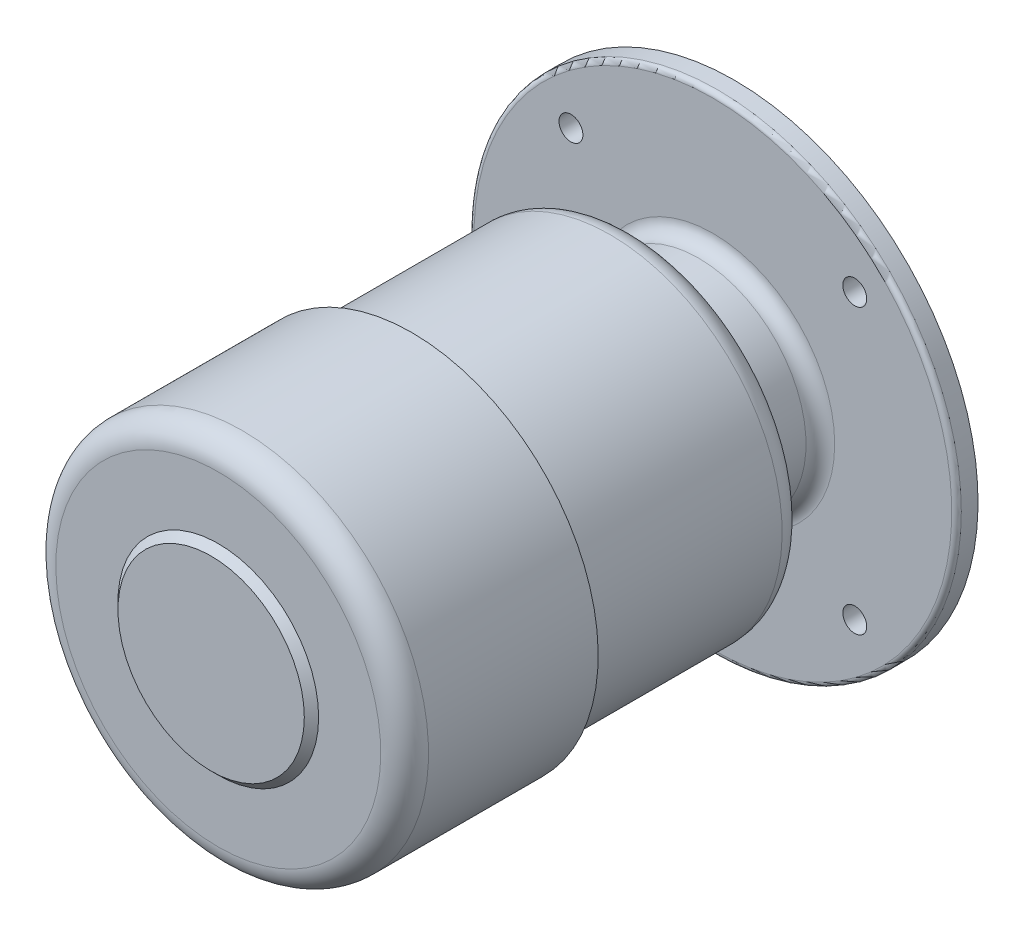
ISO-10303-21;
HEADER;
FILE_DESCRIPTION(('STEP AP214'),'2;1');
FILE_NAME('part.step','',(''),(''),'','','');
FILE_SCHEMA(('AUTOMOTIVE_DESIGN { 1 0 10303 214 1 1 1 1 }'));
ENDSEC;
DATA;
#1=APPLICATION_CONTEXT('core data for automotive mechanical design processes');
#2=APPLICATION_PROTOCOL_DEFINITION('international standard','automotive_design',2000,#1);
#3=PRODUCT_CONTEXT('',#1,'mechanical');
#4=PRODUCT('Part','Part','',(#3));
#5=PRODUCT_RELATED_PRODUCT_CATEGORY('part','',(#4));
#6=PRODUCT_DEFINITION_FORMATION('','',#4);
#7=PRODUCT_DEFINITION_CONTEXT('part definition',#1,'design');
#8=PRODUCT_DEFINITION('design','',#6,#7);
#9=PRODUCT_DEFINITION_SHAPE('','',#8);
#10=(LENGTH_UNIT() NAMED_UNIT(*) SI_UNIT(.MILLI.,.METRE.));
#11=(NAMED_UNIT(*) PLANE_ANGLE_UNIT() SI_UNIT($,.RADIAN.));
#12=(NAMED_UNIT(*) SI_UNIT($,.STERADIAN.) SOLID_ANGLE_UNIT());
#13=UNCERTAINTY_MEASURE_WITH_UNIT(LENGTH_MEASURE(1.E-05),#10,'distance_accuracy_value','');
#14=(GEOMETRIC_REPRESENTATION_CONTEXT(3) GLOBAL_UNCERTAINTY_ASSIGNED_CONTEXT((#13)) GLOBAL_UNIT_ASSIGNED_CONTEXT((#10,
#11,#12)) REPRESENTATION_CONTEXT('',''));
#15=CARTESIAN_POINT('',(0.,0.,0.));
#16=DIRECTION('',(0.,0.,1.));
#17=DIRECTION('',(1.,0.,0.));
#18=AXIS2_PLACEMENT_3D('',#15,#16,#17);
#19=CARTESIAN_POINT('',(78.,0.,226.));
#20=DIRECTION('',(0.,0.,1.));
#21=DIRECTION('',(0.,-1.,0.));
#22=AXIS2_PLACEMENT_3D('',#19,#20,#21);
#23=PLANE('',#22);
#24=CARTESIAN_POINT('',(0.,0.,226.));
#25=DIRECTION('',(0.,0.,1.));
#26=DIRECTION('',(0.,-1.,0.));
#27=AXIS2_PLACEMENT_3D('',#24,#25,#26);
#28=CIRCLE('',#27,68.);
#29=CARTESIAN_POINT('',(0.,-68.,226.));
#30=VERTEX_POINT('',#29);
#31=EDGE_CURVE('E11',#30,#30,#28,.T.);
#32=ORIENTED_EDGE('',*,*,#31,.T.);
#33=EDGE_LOOP('',(#32));
#34=FACE_BOUND('',#33,.T.);
#35=CARTESIAN_POINT('',(0.,0.,226.));
#36=DIRECTION('',(0.,0.,1.));
#37=DIRECTION('',(1.,0.,0.));
#38=AXIS2_PLACEMENT_3D('',#35,#36,#37);
#39=CIRCLE('',#38,42.0000000000182);
#40=CARTESIAN_POINT('',(42.0000000000182,0.,226.));
#41=VERTEX_POINT('',#40);
#42=EDGE_CURVE('E487',#41,#41,#39,.T.);
#43=ORIENTED_EDGE('',*,*,#42,.F.);
#44=EDGE_LOOP('',(#43));
#45=FACE_BOUND('',#44,.T.);
#46=ADVANCED_FACE('F35',(#34,#45),#23,.T.);
#47=CARTESIAN_POINT('',(0.,0.,4.));
#48=DIRECTION('',(0.,0.,-1.));
#49=DIRECTION('',(0.,1.,0.));
#50=AXIS2_PLACEMENT_3D('',#47,#48,#49);
#51=PLANE('',#50);
#52=CARTESIAN_POINT('',(0.,0.,4.));
#53=DIRECTION('',(0.,0.,-1.));
#54=DIRECTION('',(0.,1.,0.));
#55=AXIS2_PLACEMENT_3D('',#52,#53,#54);
#56=CIRCLE('',#55,66.);
#57=CARTESIAN_POINT('',(0.,66.,4.));
#58=VERTEX_POINT('',#57);
#59=EDGE_CURVE('E126',#58,#58,#56,.T.);
#60=ORIENTED_EDGE('',*,*,#59,.T.);
#61=EDGE_LOOP('',(#60));
#62=FACE_BOUND('',#61,.T.);
#63=DIRECTION('',(-0.707106781186548,0.707106781186548,0.));
#64=VECTOR('',#63,1.);
#65=CARTESIAN_POINT('',(-6.09451801902431,10.3371587061264,4.));
#66=LINE('',#65,#64);
#67=CARTESIAN_POINT('',(-2.12132034357303,6.36396103067513,4.));
#68=VERTEX_POINT('',#67);
#69=CARTESIAN_POINT('',(-6.09451801902431,10.3371587061264,4.));
#70=VERTEX_POINT('',#69);
#71=EDGE_CURVE('E86',#68,#70,#66,.T.);
#72=ORIENTED_EDGE('',*,*,#71,.F.);
#73=DIRECTION('',(0.707106781186547,0.707106781186547,0.));
#74=VECTOR('',#73,1.);
#75=CARTESIAN_POINT('',(-2.12132034357303,6.36396103067513,4.));
#76=LINE('',#75,#74);
#77=CARTESIAN_POINT('',(-6.36396103066576,2.12132034358241,4.));
#78=VERTEX_POINT('',#77);
#79=EDGE_CURVE('E98',#78,#68,#76,.T.);
#80=ORIENTED_EDGE('',*,*,#79,.F.);
#81=DIRECTION('',(0.707106781186548,-0.707106781186548,0.));
#82=VECTOR('',#81,1.);
#83=CARTESIAN_POINT('',(-6.36396103066576,2.12132034358241,4.));
#84=LINE('',#83,#82);
#85=CARTESIAN_POINT('',(-10.3371587061195,6.0945180190361,4.));
#86=VERTEX_POINT('',#85);
#87=EDGE_CURVE('E110',#86,#78,#84,.T.);
#88=ORIENTED_EDGE('',*,*,#87,.F.);
#89=CARTESIAN_POINT('',(0.,0.,4.));
#90=DIRECTION('',(0.,0.,-1.));
#91=DIRECTION('',(0.,-1.,0.));
#92=AXIS2_PLACEMENT_3D('',#89,#90,#91);
#93=CIRCLE('',#92,11.999999999994);
#94=EDGE_CURVE('E108',#70,#86,#93,.T.);
#95=ORIENTED_EDGE('',*,*,#94,.F.);
#96=EDGE_LOOP('',(#72,#80,#88,#95));
#97=FACE_BOUND('',#96,.T.);
#98=ADVANCED_FACE('F106',(#62,#97),#51,.T.);
#99=CARTESIAN_POINT('',(0.,0.,10.));
#100=DIRECTION('',(0.,0.,-1.));
#101=DIRECTION('',(0.,1.,0.));
#102=AXIS2_PLACEMENT_3D('',#99,#100,#101);
#103=PLANE('',#102);
#104=CARTESIAN_POINT('',(-59.3969696197,59.3969696197,10.));
#105=DIRECTION('',(0.,0.,-1.));
#106=DIRECTION('',(0.,1.,0.));
#107=AXIS2_PLACEMENT_3D('',#104,#105,#106);
#108=CIRCLE('',#107,4.99999999999999);
#109=CARTESIAN_POINT('',(-59.3969696197,64.3969696197,10.));
#110=VERTEX_POINT('',#109);
#111=EDGE_CURVE('E503',#110,#110,#108,.T.);
#112=ORIENTED_EDGE('',*,*,#111,.F.);
#113=EDGE_LOOP('',(#112));
#114=FACE_BOUND('',#113,.T.);
#115=CARTESIAN_POINT('',(-59.3969696197,-59.3969696197,10.));
#116=DIRECTION('',(0.,0.,-1.));
#117=DIRECTION('',(0.,1.,0.));
#118=AXIS2_PLACEMENT_3D('',#115,#116,#117);
#119=CIRCLE('',#118,4.99999999999999);
#120=CARTESIAN_POINT('',(-59.3969696197,-54.3969696197,10.));
#121=VERTEX_POINT('',#120);
#122=EDGE_CURVE('E499',#121,#121,#119,.T.);
#123=ORIENTED_EDGE('',*,*,#122,.F.);
#124=EDGE_LOOP('',(#123));
#125=FACE_BOUND('',#124,.T.);
#126=CARTESIAN_POINT('',(59.3969696197,59.3969696197,10.));
#127=DIRECTION('',(0.,0.,-1.));
#128=DIRECTION('',(0.,1.,0.));
#129=AXIS2_PLACEMENT_3D('',#126,#127,#128);
#130=CIRCLE('',#129,4.99999999999999);
#131=CARTESIAN_POINT('',(59.3969696197,64.3969696197,10.));
#132=VERTEX_POINT('',#131);
#133=EDGE_CURVE('E484',#132,#132,#130,.T.);
#134=ORIENTED_EDGE('',*,*,#133,.F.);
#135=EDGE_LOOP('',(#134));
#136=FACE_BOUND('',#135,.T.);
#137=CARTESIAN_POINT('',(59.3969696197,-59.3969696197,10.));
#138=DIRECTION('',(0.,0.,-1.));
#139=DIRECTION('',(0.,1.,0.));
#140=AXIS2_PLACEMENT_3D('',#137,#138,#139);
#141=CIRCLE('',#140,4.99999999999999);
#142=CARTESIAN_POINT('',(59.3969696197,-54.3969696197,10.));
#143=VERTEX_POINT('',#142);
#144=EDGE_CURVE('E483',#143,#143,#141,.T.);
#145=ORIENTED_EDGE('',*,*,#144,.F.);
#146=EDGE_LOOP('',(#145));
#147=FACE_BOUND('',#146,.T.);
#148=CARTESIAN_POINT('',(0.,0.,10.));
#149=DIRECTION('',(0.,0.,-1.));
#150=DIRECTION('',(0.,1.,0.));
#151=AXIS2_PLACEMENT_3D('',#148,#149,#150);
#152=CIRCLE('',#151,102.);
#153=CARTESIAN_POINT('',(0.,102.,10.));
#154=VERTEX_POINT('',#153);
#155=EDGE_CURVE('E129',#154,#154,#152,.T.);
#156=ORIENTED_EDGE('',*,*,#155,.T.);
#157=EDGE_LOOP('',(#156));
#158=FACE_BOUND('',#157,.T.);
#159=CARTESIAN_POINT('',(0.,0.,10.));
#160=DIRECTION('',(0.,0.,-1.));
#161=DIRECTION('',(0.,1.,0.));
#162=AXIS2_PLACEMENT_3D('',#159,#160,#161);
#163=CIRCLE('',#162,66.);
#164=CARTESIAN_POINT('',(0.,66.,10.));
#165=VERTEX_POINT('',#164);
#166=EDGE_CURVE('E93',#165,#165,#163,.T.);
#167=ORIENTED_EDGE('',*,*,#166,.F.);
#168=EDGE_LOOP('',(#167));
#169=FACE_BOUND('',#168,.T.);
#170=ADVANCED_FACE('F217',(#114,#125,#136,#147,#158,#169),#103,.T.);
#171=CARTESIAN_POINT('',(0.,0.,226.));
#172=DIRECTION('',(0.,0.,-1.));
#173=DIRECTION('',(0.,1.,0.));
#174=AXIS2_PLACEMENT_3D('',#171,#172,#173);
#175=CYLINDRICAL_SURFACE('',#174,78.);
#176=CARTESIAN_POINT('',(0.,0.,216.));
#177=DIRECTION('',(0.,0.,1.));
#178=DIRECTION('',(0.,-1.,0.));
#179=AXIS2_PLACEMENT_3D('',#176,#177,#178);
#180=CIRCLE('',#179,78.);
#181=CARTESIAN_POINT('',(0.,-78.,216.));
#182=VERTEX_POINT('',#181);
#183=EDGE_CURVE('E43',#182,#182,#180,.F.);
#184=ORIENTED_EDGE('',*,*,#183,.T.);
#185=EDGE_LOOP('',(#184));
#186=FACE_BOUND('',#185,.T.);
#187=CARTESIAN_POINT('',(0.,0.,145.));
#188=DIRECTION('',(0.,0.,-1.));
#189=DIRECTION('',(0.,1.,0.));
#190=AXIS2_PLACEMENT_3D('',#187,#188,#189);
#191=CIRCLE('',#190,78.);
#192=CARTESIAN_POINT('',(0.,78.,145.));
#193=VERTEX_POINT('',#192);
#194=EDGE_CURVE('E135',#193,#193,#191,.T.);
#195=ORIENTED_EDGE('',*,*,#194,.F.);
#196=EDGE_LOOP('',(#195));
#197=FACE_BOUND('',#196,.T.);
#198=ADVANCED_FACE('F37',(#186,#197),#175,.T.);
#199=CARTESIAN_POINT('',(72.,0.,145.));
#200=DIRECTION('',(0.,0.,-1.));
#201=DIRECTION('',(0.,1.,0.));
#202=AXIS2_PLACEMENT_3D('',#199,#200,#201);
#203=PLANE('',#202);
#204=ORIENTED_EDGE('',*,*,#194,.T.);
#205=EDGE_LOOP('',(#204));
#206=FACE_BOUND('',#205,.T.);
#207=CARTESIAN_POINT('',(0.,0.,145.));
#208=DIRECTION('',(0.,0.,-1.));
#209=DIRECTION('',(0.,1.,0.));
#210=AXIS2_PLACEMENT_3D('',#207,#208,#209);
#211=CIRCLE('',#210,72.);
#212=CARTESIAN_POINT('',(0.,72.,145.));
#213=VERTEX_POINT('',#212);
#214=EDGE_CURVE('E132',#213,#213,#211,.T.);
#215=ORIENTED_EDGE('',*,*,#214,.F.);
#216=EDGE_LOOP('',(#215));
#217=FACE_BOUND('',#216,.T.);
#218=ADVANCED_FACE('F244',(#206,#217),#203,.T.);
#219=CARTESIAN_POINT('',(0.,0.,226.));
#220=DIRECTION('',(0.,0.,-1.));
#221=DIRECTION('',(0.,1.,0.));
#222=AXIS2_PLACEMENT_3D('',#219,#220,#221);
#223=CYLINDRICAL_SURFACE('',#222,72.);
#224=CARTESIAN_POINT('',(0.,0.,62.));
#225=DIRECTION('',(0.,0.,-1.));
#226=DIRECTION('',(0.,1.,0.));
#227=AXIS2_PLACEMENT_3D('',#224,#225,#226);
#228=CIRCLE('',#227,72.);
#229=CARTESIAN_POINT('',(0.,72.,62.));
#230=VERTEX_POINT('',#229);
#231=EDGE_CURVE('E192',#230,#230,#228,.F.);
#232=ORIENTED_EDGE('',*,*,#231,.T.);
#233=EDGE_LOOP('',(#232));
#234=FACE_BOUND('',#233,.T.);
#235=ORIENTED_EDGE('',*,*,#214,.T.);
#236=EDGE_LOOP('',(#235));
#237=FACE_BOUND('',#236,.T.);
#238=ADVANCED_FACE('F241',(#234,#237),#223,.T.);
#239=CARTESIAN_POINT('',(45.,0.,52.));
#240=DIRECTION('',(0.,0.,-1.));
#241=DIRECTION('',(0.,1.,0.));
#242=AXIS2_PLACEMENT_3D('',#239,#240,#241);
#243=PLANE('',#242);
#244=CARTESIAN_POINT('',(0.,0.,52.));
#245=DIRECTION('',(0.,0.,-1.));
#246=DIRECTION('',(0.,1.,0.));
#247=AXIS2_PLACEMENT_3D('',#244,#245,#246);
#248=CIRCLE('',#247,62.);
#249=CARTESIAN_POINT('',(0.,62.,52.));
#250=VERTEX_POINT('',#249);
#251=EDGE_CURVE('E189',#250,#250,#248,.T.);
#252=ORIENTED_EDGE('',*,*,#251,.T.);
#253=EDGE_LOOP('',(#252));
#254=FACE_BOUND('',#253,.T.);
#255=CARTESIAN_POINT('',(0.,0.,52.));
#256=DIRECTION('',(0.,0.,-1.));
#257=DIRECTION('',(0.,1.,0.));
#258=AXIS2_PLACEMENT_3D('',#255,#256,#257);
#259=CIRCLE('',#258,51.);
#260=CARTESIAN_POINT('',(0.,51.,52.));
#261=VERTEX_POINT('',#260);
#262=EDGE_CURVE('E180',#261,#261,#259,.F.);
#263=ORIENTED_EDGE('',*,*,#262,.T.);
#264=EDGE_LOOP('',(#263));
#265=FACE_BOUND('',#264,.T.);
#266=ADVANCED_FACE('F237',(#254,#265),#243,.T.);
#267=CARTESIAN_POINT('',(0.,0.,226.));
#268=DIRECTION('',(0.,0.,-1.));
#269=DIRECTION('',(0.,1.,0.));
#270=AXIS2_PLACEMENT_3D('',#267,#268,#269);
#271=CYLINDRICAL_SURFACE('',#270,45.);
#272=CARTESIAN_POINT('',(0.,0.,25.));
#273=DIRECTION('',(0.,0.,1.));
#274=DIRECTION('',(0.,-1.,0.));
#275=AXIS2_PLACEMENT_3D('',#272,#273,#274);
#276=CIRCLE('',#275,45.);
#277=CARTESIAN_POINT('',(0.,-45.,25.));
#278=VERTEX_POINT('',#277);
#279=EDGE_CURVE('E186',#278,#278,#276,.T.);
#280=ORIENTED_EDGE('',*,*,#279,.T.);
#281=EDGE_LOOP('',(#280));
#282=FACE_BOUND('',#281,.T.);
#283=CARTESIAN_POINT('',(0.,0.,46.));
#284=DIRECTION('',(0.,0.,-1.));
#285=DIRECTION('',(0.,1.,0.));
#286=AXIS2_PLACEMENT_3D('',#283,#284,#285);
#287=CIRCLE('',#286,45.);
#288=CARTESIAN_POINT('',(0.,45.,46.));
#289=VERTEX_POINT('',#288);
#290=EDGE_CURVE('E177',#289,#289,#287,.T.);
#291=ORIENTED_EDGE('',*,*,#290,.T.);
#292=EDGE_LOOP('',(#291));
#293=FACE_BOUND('',#292,.T.);
#294=ADVANCED_FACE('F233',(#282,#293),#271,.T.);
#295=CARTESIAN_POINT('',(102.,0.,19.));
#296=DIRECTION('',(0.,0.,1.));
#297=DIRECTION('',(0.,-1.,0.));
#298=AXIS2_PLACEMENT_3D('',#295,#296,#297);
#299=PLANE('',#298);
#300=CARTESIAN_POINT('',(0.,0.,19.));
#301=DIRECTION('',(0.,0.,1.));
#302=DIRECTION('',(0.,-1.,0.));
#303=AXIS2_PLACEMENT_3D('',#300,#301,#302);
#304=CIRCLE('',#303,51.);
#305=CARTESIAN_POINT('',(0.,-51.,19.));
#306=VERTEX_POINT('',#305);
#307=EDGE_CURVE('E183',#306,#306,#304,.F.);
#308=ORIENTED_EDGE('',*,*,#307,.T.);
#309=EDGE_LOOP('',(#308));
#310=FACE_BOUND('',#309,.T.);
#311=CARTESIAN_POINT('',(0.,0.,19.));
#312=DIRECTION('',(0.,0.,1.));
#313=DIRECTION('',(0.,-1.,0.));
#314=AXIS2_PLACEMENT_3D('',#311,#312,#313);
#315=CIRCLE('',#314,100.);
#316=CARTESIAN_POINT('',(0.,-100.,19.));
#317=VERTEX_POINT('',#316);
#318=EDGE_CURVE('E174',#317,#317,#315,.T.);
#319=ORIENTED_EDGE('',*,*,#318,.T.);
#320=EDGE_LOOP('',(#319));
#321=FACE_BOUND('',#320,.T.);
#322=CARTESIAN_POINT('',(-59.3969696197,59.3969696197,19.));
#323=DIRECTION('',(0.,0.,1.));
#324=DIRECTION('',(1.,0.,0.));
#325=AXIS2_PLACEMENT_3D('',#322,#323,#324);
#326=CIRCLE('',#325,4.99999999999998);
#327=CARTESIAN_POINT('',(-54.3969696197,59.3969696197,19.));
#328=VERTEX_POINT('',#327);
#329=EDGE_CURVE('E471',#328,#328,#326,.T.);
#330=ORIENTED_EDGE('',*,*,#329,.F.);
#331=EDGE_LOOP('',(#330));
#332=FACE_BOUND('',#331,.T.);
#333=CARTESIAN_POINT('',(-59.3969696197,-59.3969696197,19.));
#334=DIRECTION('',(0.,0.,1.));
#335=DIRECTION('',(1.,0.,0.));
#336=AXIS2_PLACEMENT_3D('',#333,#334,#335);
#337=CIRCLE('',#336,4.99999999999998);
#338=CARTESIAN_POINT('',(-54.3969696197,-59.3969696197,19.));
#339=VERTEX_POINT('',#338);
#340=EDGE_CURVE('E475',#339,#339,#337,.T.);
#341=ORIENTED_EDGE('',*,*,#340,.F.);
#342=EDGE_LOOP('',(#341));
#343=FACE_BOUND('',#342,.T.);
#344=CARTESIAN_POINT('',(59.3969696197,59.3969696197,19.));
#345=DIRECTION('',(0.,0.,1.));
#346=DIRECTION('',(1.,0.,0.));
#347=AXIS2_PLACEMENT_3D('',#344,#345,#346);
#348=CIRCLE('',#347,4.99999999999998);
#349=CARTESIAN_POINT('',(64.3969696197,59.3969696197,19.));
#350=VERTEX_POINT('',#349);
#351=EDGE_CURVE('E479',#350,#350,#348,.T.);
#352=ORIENTED_EDGE('',*,*,#351,.F.);
#353=EDGE_LOOP('',(#352));
#354=FACE_BOUND('',#353,.T.);
#355=CARTESIAN_POINT('',(59.3969696197,-59.3969696197,19.));
#356=DIRECTION('',(0.,0.,1.));
#357=DIRECTION('',(1.,0.,0.));
#358=AXIS2_PLACEMENT_3D('',#355,#356,#357);
#359=CIRCLE('',#358,4.99999999999998);
#360=CARTESIAN_POINT('',(64.3969696197,-59.3969696197,19.));
#361=VERTEX_POINT('',#360);
#362=EDGE_CURVE('E482',#361,#361,#359,.T.);
#363=ORIENTED_EDGE('',*,*,#362,.F.);
#364=EDGE_LOOP('',(#363));
#365=FACE_BOUND('',#364,.T.);
#366=ADVANCED_FACE('F229',(#310,#321,#332,#343,#354,#365),#299,.T.);
#367=CARTESIAN_POINT('',(0.,0.,226.));
#368=DIRECTION('',(0.,0.,-1.));
#369=DIRECTION('',(0.,1.,0.));
#370=AXIS2_PLACEMENT_3D('',#367,#368,#369);
#371=CYLINDRICAL_SURFACE('',#370,102.);
#372=CARTESIAN_POINT('',(0.,0.,17.));
#373=DIRECTION('',(0.,0.,1.));
#374=DIRECTION('',(0.,-1.,0.));
#375=AXIS2_PLACEMENT_3D('',#372,#373,#374);
#376=CIRCLE('',#375,102.);
#377=CARTESIAN_POINT('',(0.,-102.,17.));
#378=VERTEX_POINT('',#377);
#379=EDGE_CURVE('E171',#378,#378,#376,.F.);
#380=ORIENTED_EDGE('',*,*,#379,.T.);
#381=EDGE_LOOP('',(#380));
#382=FACE_BOUND('',#381,.T.);
#383=ORIENTED_EDGE('',*,*,#155,.F.);
#384=EDGE_LOOP('',(#383));
#385=FACE_BOUND('',#384,.T.);
#386=ADVANCED_FACE('F226',(#382,#385),#371,.T.);
#387=CARTESIAN_POINT('',(0.,0.,4.));
#388=DIRECTION('',(0.,0.,1.));
#389=DIRECTION('',(0.,-1.,0.));
#390=AXIS2_PLACEMENT_3D('',#387,#388,#389);
#391=CYLINDRICAL_SURFACE('',#390,66.);
#392=ORIENTED_EDGE('',*,*,#59,.F.);
#393=EDGE_LOOP('',(#392));
#394=FACE_BOUND('',#393,.T.);
#395=ORIENTED_EDGE('',*,*,#166,.T.);
#396=EDGE_LOOP('',(#395));
#397=FACE_BOUND('',#396,.T.);
#398=ADVANCED_FACE('F222',(#394,#397),#391,.T.);
#399=CARTESIAN_POINT('',(-2.12132034357303,6.36396103067513,-32.));
#400=DIRECTION('',(0.707106781186547,-0.707106781186547,0.));
#401=DIRECTION('',(0.707106781186548,0.707106781186548,0.));
#402=AXIS2_PLACEMENT_3D('',#399,#400,#401);
#403=PLANE('',#402);
#404=ORIENTED_EDGE('',*,*,#79,.T.);
#405=DIRECTION('',(0.,0.,1.));
#406=VECTOR('',#405,1.);
#407=CARTESIAN_POINT('',(-2.12132034357303,6.36396103067513,-32.));
#408=LINE('',#407,#406);
#409=CARTESIAN_POINT('',(-2.12132034357303,6.36396103067513,-32.));
#410=VERTEX_POINT('',#409);
#411=EDGE_CURVE('E82',#410,#68,#408,.T.);
#412=ORIENTED_EDGE('',*,*,#411,.F.);
#413=DIRECTION('',(0.707106781186547,0.707106781186547,0.));
#414=VECTOR('',#413,1.);
#415=CARTESIAN_POINT('',(-2.12132034357303,6.36396103067513,-32.));
#416=LINE('',#415,#414);
#417=CARTESIAN_POINT('',(-6.36396103066576,2.12132034358241,-32.));
#418=VERTEX_POINT('',#417);
#419=EDGE_CURVE('E115',#418,#410,#416,.T.);
#420=ORIENTED_EDGE('',*,*,#419,.F.);
#421=DIRECTION('',(0.,0.,1.));
#422=VECTOR('',#421,1.);
#423=CARTESIAN_POINT('',(-6.36396103066576,2.12132034358241,-32.));
#424=LINE('',#423,#422);
#425=EDGE_CURVE('E101',#418,#78,#424,.T.);
#426=ORIENTED_EDGE('',*,*,#425,.T.);
#427=EDGE_LOOP('',(#404,#412,#420,#426));
#428=FACE_BOUND('',#427,.T.);
#429=ADVANCED_FACE('F99',(#428),#403,.F.);
#430=CARTESIAN_POINT('',(-6.09451801902431,10.3371587061264,-32.));
#431=DIRECTION('',(0.707106781186548,0.707106781186548,0.));
#432=DIRECTION('',(-0.707106781186548,0.707106781186548,0.));
#433=AXIS2_PLACEMENT_3D('',#430,#431,#432);
#434=PLANE('',#433);
#435=DIRECTION('',(0.,0.,1.));
#436=VECTOR('',#435,1.);
#437=CARTESIAN_POINT('',(-6.09451801902431,10.3371587061264,-32.));
#438=LINE('',#437,#436);
#439=CARTESIAN_POINT('',(-6.09451801902431,10.3371587061264,-30.0000000000005));
#440=VERTEX_POINT('',#439);
#441=EDGE_CURVE('E94',#440,#70,#438,.T.);
#442=ORIENTED_EDGE('',*,*,#441,.F.);
#443=CARTESIAN_POINT('',(-6.09451801902431,10.3371587061264,-30.0000000000005));
#444=CARTESIAN_POINT('',(-5.97237529618539,10.2150159832875,-30.1672487687506));
#445=CARTESIAN_POINT('',(-5.85015159438801,10.0927922814901,-30.3343793747263));
#446=CARTESIAN_POINT('',(-5.6055164638558,9.84815715095791,-30.6683643774604));
#447=CARTESIAN_POINT('',(-5.48310503576151,9.72574572286362,-30.8352187751574));
#448=CARTESIAN_POINT('',(-5.2380677472156,9.48070843431771,-31.168612759977));
#449=CARTESIAN_POINT('',(-5.11544188658017,9.35808257368228,-31.3351523468296));
#450=CARTESIAN_POINT('',(-4.86994076890085,9.11258145600296,-31.6678646205338));
#451=CARTESIAN_POINT('',(-4.74706551100798,8.98970619811009,-31.8340373061324));
#452=CARTESIAN_POINT('',(-4.62404843806498,8.8666891251671,-32.));
#453=B_SPLINE_CURVE_WITH_KNOTS('',3,(#443,#444,#445,#446,#447,#448,#449,#450,#451,#452),
.UNSPECIFIED.,.F.,.F.,(4,2,2,2,4),(0.,0.72131036696165,1.44261827819132,2.16392680803654,
2.88523779743343),.UNSPECIFIED.);
#454=CARTESIAN_POINT('',(-4.62404843806498,8.8666891251671,-32.));
#455=VERTEX_POINT('',#454);
#456=EDGE_CURVE('E166',#440,#455,#453,.T.);
#457=ORIENTED_EDGE('',*,*,#456,.T.);
#458=DIRECTION('',(-0.707106781186548,0.707106781186548,0.));
#459=VECTOR('',#458,1.);
#460=CARTESIAN_POINT('',(-6.09451801902431,10.3371587061264,-32.));
#461=LINE('',#460,#459);
#462=EDGE_CURVE('E89',#410,#455,#461,.T.);
#463=ORIENTED_EDGE('',*,*,#462,.F.);
#464=ORIENTED_EDGE('',*,*,#411,.T.);
#465=ORIENTED_EDGE('',*,*,#71,.T.);
#466=EDGE_LOOP('',(#442,#457,#463,#464,#465));
#467=FACE_BOUND('',#466,.T.);
#468=ADVANCED_FACE('F84',(#467),#434,.F.);
#469=CARTESIAN_POINT('',(0.,0.,-32.));
#470=DIRECTION('',(0.,0.,1.));
#471=DIRECTION('',(0.,-1.,0.));
#472=AXIS2_PLACEMENT_3D('',#469,#470,#471);
#473=CYLINDRICAL_SURFACE('',#472,11.999999999994);
#474=DIRECTION('',(0.,0.,1.));
#475=VECTOR('',#474,1.);
#476=CARTESIAN_POINT('',(-10.3371587061195,6.0945180190361,-32.));
#477=LINE('',#476,#475);
#478=CARTESIAN_POINT('',(-10.3371587061195,6.0945180190361,-30.0000000000005));
#479=VERTEX_POINT('',#478);
#480=EDGE_CURVE('E121',#479,#86,#477,.T.);
#481=ORIENTED_EDGE('',*,*,#480,.F.);
#482=CARTESIAN_POINT('',(0.,0.,-30.0000000000005));
#483=DIRECTION('',(0.,0.,1.));
#484=DIRECTION('',(1.,0.,0.));
#485=AXIS2_PLACEMENT_3D('',#482,#483,#484);
#486=CIRCLE('',#485,11.999999999994);
#487=EDGE_CURVE('E50',#479,#440,#486,.T.);
#488=ORIENTED_EDGE('',*,*,#487,.T.);
#489=ORIENTED_EDGE('',*,*,#441,.T.);
#490=ORIENTED_EDGE('',*,*,#94,.T.);
#491=EDGE_LOOP('',(#481,#488,#489,#490));
#492=FACE_BOUND('',#491,.T.);
#493=ADVANCED_FACE('F158',(#492),#473,.T.);
#494=CARTESIAN_POINT('',(-6.36396103066576,2.12132034358241,-32.));
#495=DIRECTION('',(-0.707106781186548,-0.707106781186548,0.));
#496=DIRECTION('',(0.707106781186548,-0.707106781186548,0.));
#497=AXIS2_PLACEMENT_3D('',#494,#495,#496);
#498=PLANE('',#497);
#499=DIRECTION('',(0.707106781186548,-0.707106781186548,0.));
#500=VECTOR('',#499,1.);
#501=CARTESIAN_POINT('',(-6.36396103066576,2.12132034358241,-32.));
#502=LINE('',#501,#500);
#503=CARTESIAN_POINT('',(-8.86668912516066,4.6240484380773,-32.));
#504=VERTEX_POINT('',#503);
#505=EDGE_CURVE('E118',#504,#418,#502,.T.);
#506=ORIENTED_EDGE('',*,*,#505,.F.);
#507=CARTESIAN_POINT('',(-8.86668912516066,4.6240484380773,-32.));
#508=CARTESIAN_POINT('',(-8.9897061981036,4.74706551102025,-31.8340373061324));
#509=CARTESIAN_POINT('',(-9.11258145599643,4.86994076891307,-31.6678646205338));
#510=CARTESIAN_POINT('',(-9.35808257367566,5.1154418865923,-31.3351523468296));
#511=CARTESIAN_POINT('',(-9.48070843431104,5.23806774722769,-31.168612759977));
#512=CARTESIAN_POINT('',(-9.72574572285686,5.48310503577351,-30.8352187751574));
#513=CARTESIAN_POINT('',(-9.84815715095111,5.60551646386776,-30.6683643774604));
#514=CARTESIAN_POINT('',(-10.0927922814832,5.85015159439989,-30.3343793747263));
#515=CARTESIAN_POINT('',(-10.2150159832806,5.97237529619722,-30.1672487687506));
#516=CARTESIAN_POINT('',(-10.3371587061195,6.0945180190361,-30.0000000000005));
#517=B_SPLINE_CURVE_WITH_KNOTS('',3,(#507,#508,#509,#510,#511,#512,#513,#514,#515,#516),
.UNSPECIFIED.,.F.,.F.,(4,2,2,2,4),(0.,0.721310989396761,1.44261951924184,2.16392743047138,
2.8852377974329),.UNSPECIFIED.);
#518=EDGE_CURVE('E58',#504,#479,#517,.T.);
#519=ORIENTED_EDGE('',*,*,#518,.T.);
#520=ORIENTED_EDGE('',*,*,#480,.T.);
#521=ORIENTED_EDGE('',*,*,#87,.T.);
#522=ORIENTED_EDGE('',*,*,#425,.F.);
#523=EDGE_LOOP('',(#506,#519,#520,#521,#522));
#524=FACE_BOUND('',#523,.T.);
#525=ADVANCED_FACE('F152',(#524),#498,.F.);
#526=CARTESIAN_POINT('',(0.,0.,-32.));
#527=DIRECTION('',(0.,0.,1.));
#528=DIRECTION('',(0.,-1.,0.));
#529=AXIS2_PLACEMENT_3D('',#526,#527,#528);
#530=PLANE('',#529);
#531=ORIENTED_EDGE('',*,*,#462,.T.);
#532=CARTESIAN_POINT('',(0.,0.,-32.));
#533=DIRECTION('',(0.,0.,1.));
#534=DIRECTION('',(0.,-1.,0.));
#535=AXIS2_PLACEMENT_3D('',#532,#533,#534);
#536=CIRCLE('',#535,9.99999999999637);
#537=EDGE_CURVE('E138',#455,#504,#536,.F.);
#538=ORIENTED_EDGE('',*,*,#537,.T.);
#539=ORIENTED_EDGE('',*,*,#505,.T.);
#540=ORIENTED_EDGE('',*,*,#419,.T.);
#541=EDGE_LOOP('',(#531,#538,#539,#540));
#542=FACE_BOUND('',#541,.T.);
#543=ADVANCED_FACE('F157',(#542),#530,.F.);
#544=CARTESIAN_POINT('',(0.,0.,226.));
#545=DIRECTION('',(0.,0.,-1.));
#546=DIRECTION('',(1.,0.,0.));
#547=AXIS2_PLACEMENT_3D('',#544,#545,#546);
#548=CONICAL_SURFACE('',#547,42.0000000000182,0.785398163396998);
#549=CARTESIAN_POINT('',(0.,0.,229.));
#550=DIRECTION('',(0.,0.,1.));
#551=DIRECTION('',(1.,0.,0.));
#552=AXIS2_PLACEMENT_3D('',#549,#550,#551);
#553=CIRCLE('',#552,39.0000000000209);
#554=CARTESIAN_POINT('',(39.0000000000209,0.,229.));
#555=VERTEX_POINT('',#554);
#556=EDGE_CURVE('E104',#555,#555,#553,.T.);
#557=ORIENTED_EDGE('',*,*,#556,.F.);
#558=EDGE_LOOP('',(#557));
#559=FACE_BOUND('',#558,.T.);
#560=ORIENTED_EDGE('',*,*,#42,.T.);
#561=EDGE_LOOP('',(#560));
#562=FACE_BOUND('',#561,.T.);
#563=ADVANCED_FACE('F281',(#559,#562),#548,.T.);
#564=CARTESIAN_POINT('',(0.,0.,229.));
#565=DIRECTION('',(0.,0.,1.));
#566=DIRECTION('',(1.,0.,0.));
#567=AXIS2_PLACEMENT_3D('',#564,#565,#566);
#568=PLANE('',#567);
#569=ORIENTED_EDGE('',*,*,#556,.T.);
#570=EDGE_LOOP('',(#569));
#571=FACE_BOUND('',#570,.T.);
#572=ADVANCED_FACE('F287',(#571),#568,.T.);
#573=CARTESIAN_POINT('',(59.3969696197,-59.3969696197,19.));
#574=DIRECTION('',(0.,0.,1.));
#575=DIRECTION('',(1.,0.,0.));
#576=AXIS2_PLACEMENT_3D('',#573,#574,#575);
#577=CYLINDRICAL_SURFACE('',#576,4.99999999999999);
#578=ORIENTED_EDGE('',*,*,#362,.T.);
#579=EDGE_LOOP('',(#578));
#580=FACE_BOUND('',#579,.T.);
#581=ORIENTED_EDGE('',*,*,#144,.T.);
#582=EDGE_LOOP('',(#581));
#583=FACE_BOUND('',#582,.T.);
#584=ADVANCED_FACE('F295',(#580,#583),#577,.F.);
#585=CARTESIAN_POINT('',(59.3969696197,59.3969696197,19.));
#586=DIRECTION('',(0.,0.,1.));
#587=DIRECTION('',(1.,0.,0.));
#588=AXIS2_PLACEMENT_3D('',#585,#586,#587);
#589=CYLINDRICAL_SURFACE('',#588,4.99999999999999);
#590=ORIENTED_EDGE('',*,*,#351,.T.);
#591=EDGE_LOOP('',(#590));
#592=FACE_BOUND('',#591,.T.);
#593=ORIENTED_EDGE('',*,*,#133,.T.);
#594=EDGE_LOOP('',(#593));
#595=FACE_BOUND('',#594,.T.);
#596=ADVANCED_FACE('F304',(#592,#595),#589,.F.);
#597=CARTESIAN_POINT('',(-59.3969696197,-59.3969696197,19.));
#598=DIRECTION('',(0.,0.,1.));
#599=DIRECTION('',(1.,0.,0.));
#600=AXIS2_PLACEMENT_3D('',#597,#598,#599);
#601=CYLINDRICAL_SURFACE('',#600,4.99999999999999);
#602=ORIENTED_EDGE('',*,*,#340,.T.);
#603=EDGE_LOOP('',(#602));
#604=FACE_BOUND('',#603,.T.);
#605=ORIENTED_EDGE('',*,*,#122,.T.);
#606=EDGE_LOOP('',(#605));
#607=FACE_BOUND('',#606,.T.);
#608=ADVANCED_FACE('F313',(#604,#607),#601,.F.);
#609=CARTESIAN_POINT('',(-59.3969696197,59.3969696197,19.));
#610=DIRECTION('',(0.,0.,1.));
#611=DIRECTION('',(1.,0.,0.));
#612=AXIS2_PLACEMENT_3D('',#609,#610,#611);
#613=CYLINDRICAL_SURFACE('',#612,4.99999999999999);
#614=ORIENTED_EDGE('',*,*,#329,.T.);
#615=EDGE_LOOP('',(#614));
#616=FACE_BOUND('',#615,.T.);
#617=ORIENTED_EDGE('',*,*,#111,.T.);
#618=EDGE_LOOP('',(#617));
#619=FACE_BOUND('',#618,.T.);
#620=ADVANCED_FACE('F322',(#616,#619),#613,.F.);
#621=CARTESIAN_POINT('',(0.,0.,-32.));
#622=DIRECTION('',(0.,0.,1.));
#623=DIRECTION('',(1.,0.,0.));
#624=AXIS2_PLACEMENT_3D('',#621,#622,#623);
#625=CONICAL_SURFACE('',#624,9.99999999999637,0.785398163397003);
#626=ORIENTED_EDGE('',*,*,#456,.F.);
#627=ORIENTED_EDGE('',*,*,#487,.F.);
#628=ORIENTED_EDGE('',*,*,#518,.F.);
#629=ORIENTED_EDGE('',*,*,#537,.F.);
#630=EDGE_LOOP('',(#626,#627,#628,#629));
#631=FACE_BOUND('',#630,.T.);
#632=ADVANCED_FACE('F148',(#631),#625,.T.);
#633=CARTESIAN_POINT('',(0.,0.,17.));
#634=DIRECTION('',(0.,0.,1.));
#635=DIRECTION('',(0.,-1.,0.));
#636=AXIS2_PLACEMENT_3D('',#633,#634,#635);
#637=TOROIDAL_SURFACE('',#636,100.,2.);
#638=ORIENTED_EDGE('',*,*,#318,.F.);
#639=EDGE_LOOP('',(#638));
#640=FACE_BOUND('',#639,.T.);
#641=ORIENTED_EDGE('',*,*,#379,.F.);
#642=EDGE_LOOP('',(#641));
#643=FACE_BOUND('',#642,.T.);
#644=ADVANCED_FACE('F338',(#640,#643),#637,.T.);
#645=CARTESIAN_POINT('',(0.,0.,46.));
#646=DIRECTION('',(0.,0.,-1.));
#647=DIRECTION('',(0.,1.,0.));
#648=AXIS2_PLACEMENT_3D('',#645,#646,#647);
#649=TOROIDAL_SURFACE('',#648,51.,6.);
#650=ORIENTED_EDGE('',*,*,#262,.F.);
#651=EDGE_LOOP('',(#650));
#652=FACE_BOUND('',#651,.T.);
#653=ORIENTED_EDGE('',*,*,#290,.F.);
#654=EDGE_LOOP('',(#653));
#655=FACE_BOUND('',#654,.T.);
#656=ADVANCED_FACE('F346',(#652,#655),#649,.F.);
#657=CARTESIAN_POINT('',(0.,0.,25.));
#658=DIRECTION('',(0.,0.,1.));
#659=DIRECTION('',(0.,-1.,0.));
#660=AXIS2_PLACEMENT_3D('',#657,#658,#659);
#661=TOROIDAL_SURFACE('',#660,51.,6.);
#662=ORIENTED_EDGE('',*,*,#279,.F.);
#663=EDGE_LOOP('',(#662));
#664=FACE_BOUND('',#663,.T.);
#665=ORIENTED_EDGE('',*,*,#307,.F.);
#666=EDGE_LOOP('',(#665));
#667=FACE_BOUND('',#666,.T.);
#668=ADVANCED_FACE('F207',(#664,#667),#661,.F.);
#669=CARTESIAN_POINT('',(0.,0.,62.));
#670=DIRECTION('',(0.,0.,-1.));
#671=DIRECTION('',(0.,1.,0.));
#672=AXIS2_PLACEMENT_3D('',#669,#670,#671);
#673=TOROIDAL_SURFACE('',#672,62.,9.99999999999999);
#674=ORIENTED_EDGE('',*,*,#231,.F.);
#675=EDGE_LOOP('',(#674));
#676=FACE_BOUND('',#675,.T.);
#677=ORIENTED_EDGE('',*,*,#251,.F.);
#678=EDGE_LOOP('',(#677));
#679=FACE_BOUND('',#678,.T.);
#680=ADVANCED_FACE('F201',(#676,#679),#673,.T.);
#681=CARTESIAN_POINT('',(0.,0.,216.));
#682=DIRECTION('',(0.,0.,1.));
#683=DIRECTION('',(0.,-1.,0.));
#684=AXIS2_PLACEMENT_3D('',#681,#682,#683);
#685=TOROIDAL_SURFACE('',#684,68.,9.99999999999999);
#686=ORIENTED_EDGE('',*,*,#31,.F.);
#687=EDGE_LOOP('',(#686));
#688=FACE_BOUND('',#687,.T.);
#689=ORIENTED_EDGE('',*,*,#183,.F.);
#690=EDGE_LOOP('',(#689));
#691=FACE_BOUND('',#690,.T.);
#692=ADVANCED_FACE('F199',(#688,#691),#685,.T.);
#693=CLOSED_SHELL('',(#46,#98,#170,#198,#218,#238,#266,#294,#366,#386,#398,#429,#468,#493,#525,
#543,#563,#572,#584,#596,#608,#620,#632,#644,#656,#668,#680,#692));
#694=MANIFOLD_SOLID_BREP('B2',#693);
#695=ADVANCED_BREP_SHAPE_REPRESENTATION('',(#18,#694),#14);
#696=SHAPE_DEFINITION_REPRESENTATION(#9,#695);
ENDSEC;
END-ISO-10303-21;
